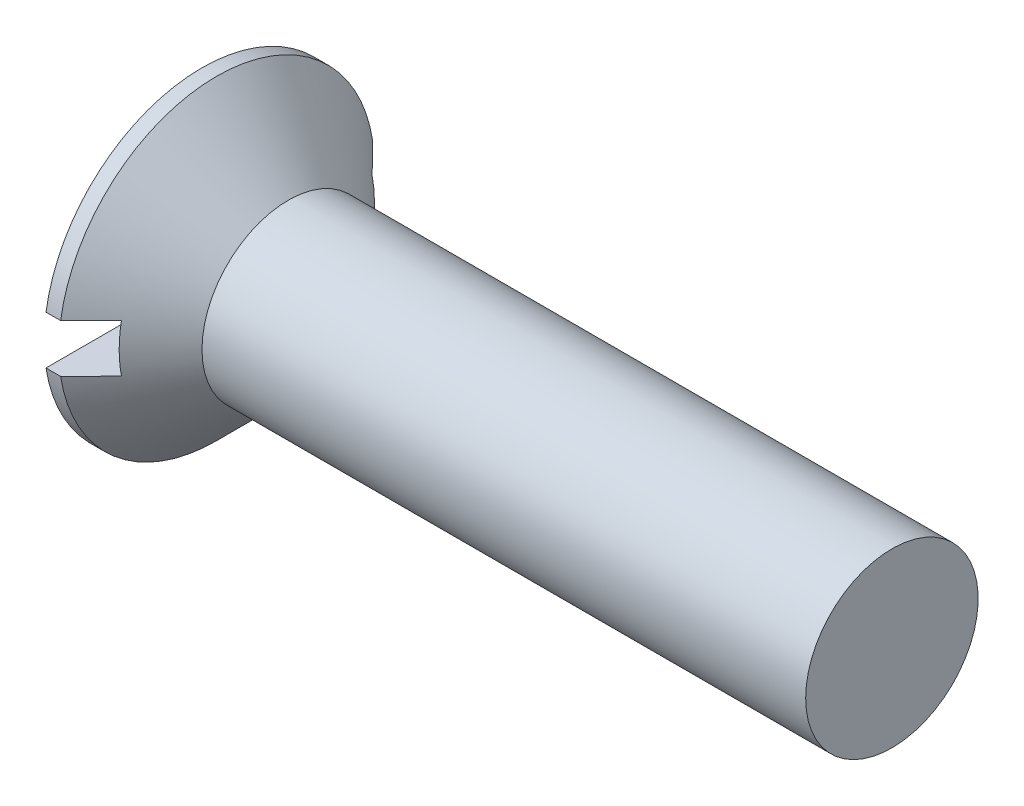
ISO-10303-21;
HEADER;
FILE_DESCRIPTION(('STEP AP214'),'2;1');
FILE_NAME('part.step','',(''),(''),'','','');
FILE_SCHEMA(('AUTOMOTIVE_DESIGN { 1 0 10303 214 1 1 1 1 }'));
ENDSEC;
DATA;
#1=APPLICATION_CONTEXT('core data for automotive mechanical design processes');
#2=APPLICATION_PROTOCOL_DEFINITION('international standard','automotive_design',2000,#1);
#3=PRODUCT_CONTEXT('',#1,'mechanical');
#4=PRODUCT('Part','Part','',(#3));
#5=PRODUCT_RELATED_PRODUCT_CATEGORY('part','',(#4));
#6=PRODUCT_DEFINITION_FORMATION('','',#4);
#7=PRODUCT_DEFINITION_CONTEXT('part definition',#1,'design');
#8=PRODUCT_DEFINITION('design','',#6,#7);
#9=PRODUCT_DEFINITION_SHAPE('','',#8);
#10=(LENGTH_UNIT() NAMED_UNIT(*) SI_UNIT(.MILLI.,.METRE.));
#11=(NAMED_UNIT(*) PLANE_ANGLE_UNIT() SI_UNIT($,.RADIAN.));
#12=(NAMED_UNIT(*) SI_UNIT($,.STERADIAN.) SOLID_ANGLE_UNIT());
#13=UNCERTAINTY_MEASURE_WITH_UNIT(LENGTH_MEASURE(1.E-05),#10,'distance_accuracy_value','');
#14=(GEOMETRIC_REPRESENTATION_CONTEXT(3) GLOBAL_UNCERTAINTY_ASSIGNED_CONTEXT((#13)) GLOBAL_UNIT_ASSIGNED_CONTEXT((#10,
#11,#12)) REPRESENTATION_CONTEXT('',''));
#15=CARTESIAN_POINT('',(0.,0.,0.));
#16=DIRECTION('',(0.,0.,1.));
#17=DIRECTION('',(1.,0.,0.));
#18=AXIS2_PLACEMENT_3D('',#15,#16,#17);
#19=CARTESIAN_POINT('',(2.6,-1.4,-9.15));
#20=DIRECTION('',(1.,0.,0.));
#21=DIRECTION('',(0.,0.,-1.));
#22=AXIS2_PLACEMENT_3D('',#19,#20,#21);
#23=PLANE('',#22);
#24=DIRECTION('',(0.,0.,1.));
#25=VECTOR('',#24,1.);
#26=CARTESIAN_POINT('',(2.6,-0.774782608695622,-9.15));
#27=LINE('',#26,#25);
#28=CARTESIAN_POINT('',(2.6,-0.774782608695655,0.774782608695653));
#29=VERTEX_POINT('',#28);
#30=CARTESIAN_POINT('',(2.6,-0.774782608695663,3.00739130434782));
#31=VERTEX_POINT('',#30);
#32=EDGE_CURVE('E165',#29,#31,#27,.T.);
#33=ORIENTED_EDGE('',*,*,#32,.F.);
#34=DIRECTION('',(0.,1.,0.));
#35=VECTOR('',#34,1.);
#36=CARTESIAN_POINT('',(2.6,-1.4,0.774782608695655));
#37=LINE('',#36,#35);
#38=CARTESIAN_POINT('',(2.6,-1.4,0.774782608695655));
#39=VERTEX_POINT('',#38);
#40=EDGE_CURVE('E11',#39,#29,#37,.T.);
#41=ORIENTED_EDGE('',*,*,#40,.F.);
#42=DIRECTION('',(0.,0.,1.));
#43=VECTOR('',#42,1.);
#44=CARTESIAN_POINT('',(2.6,-1.4,-9.15));
#45=LINE('',#44,#43);
#46=CARTESIAN_POINT('',(2.6,-1.4,7.26636084983399));
#47=VERTEX_POINT('',#46);
#48=EDGE_CURVE('E231',#39,#47,#45,.T.);
#49=ORIENTED_EDGE('',*,*,#48,.T.);
#50=CARTESIAN_POINT('',(2.6,0.,0.));
#51=DIRECTION('',(1.,0.,0.));
#52=DIRECTION('',(0.,0.,-1.));
#53=AXIS2_PLACEMENT_3D('',#50,#51,#52);
#54=CIRCLE('',#53,7.40000000000001);
#55=CARTESIAN_POINT('',(2.6,1.4,7.26636084983399));
#56=VERTEX_POINT('',#55);
#57=EDGE_CURVE('E267',#47,#56,#54,.F.);
#58=ORIENTED_EDGE('',*,*,#57,.T.);
#59=DIRECTION('',(0.,0.,-1.));
#60=VECTOR('',#59,1.);
#61=CARTESIAN_POINT('',(2.6,1.4,9.15));
#62=LINE('',#61,#60);
#63=CARTESIAN_POINT('',(2.6,1.4,0.774782608695654));
#64=VERTEX_POINT('',#63);
#65=EDGE_CURVE('E228',#56,#64,#62,.T.);
#66=ORIENTED_EDGE('',*,*,#65,.T.);
#67=CARTESIAN_POINT('',(2.6,0.774782608695649,0.774782608695653));
#68=VERTEX_POINT('',#67);
#69=EDGE_CURVE('E42',#68,#64,#37,.T.);
#70=ORIENTED_EDGE('',*,*,#69,.F.);
#71=DIRECTION('',(0.,0.,-1.));
#72=VECTOR('',#71,1.);
#73=CARTESIAN_POINT('',(2.6,0.774782608695683,-9.14999999999999));
#74=LINE('',#73,#72);
#75=CARTESIAN_POINT('',(2.6,0.774782608695642,3.00739130434783));
#76=VERTEX_POINT('',#75);
#77=EDGE_CURVE('E375',#76,#68,#74,.T.);
#78=ORIENTED_EDGE('',*,*,#77,.F.);
#79=DIRECTION('',(0.,1.,0.));
#80=VECTOR('',#79,1.);
#81=CARTESIAN_POINT('',(2.6,-1.40000000000004,3.00739130434782));
#82=LINE('',#81,#80);
#83=EDGE_CURVE('E319',#31,#76,#82,.T.);
#84=ORIENTED_EDGE('',*,*,#83,.F.);
#85=EDGE_LOOP('',(#33,#41,#49,#58,#66,#70,#78,#84));
#86=FACE_BOUND('',#85,.T.);
#87=ADVANCED_FACE('F34',(#86),#23,.F.);
#88=DIRECTION('',(0.,0.,1.));
#89=VECTOR('',#88,1.);
#90=CARTESIAN_POINT('',(2.6,-0.774782608695622,-9.15));
#91=LINE('',#90,#89);
#92=CARTESIAN_POINT('',(2.6,-0.774782608695642,-3.00739130434783));
#93=VERTEX_POINT('',#92);
#94=CARTESIAN_POINT('',(2.6,-0.77478260869565,-0.774782608695652));
#95=VERTEX_POINT('',#94);
#96=EDGE_CURVE('E190',#93,#95,#91,.T.);
#97=ORIENTED_EDGE('',*,*,#96,.F.);
#98=DIRECTION('',(0.,-1.,0.));
#99=VECTOR('',#98,1.);
#100=CARTESIAN_POINT('',(2.6,-1.40000000000002,-3.00739130434783));
#101=LINE('',#100,#99);
#102=CARTESIAN_POINT('',(2.6,0.774782608695662,-3.00739130434782));
#103=VERTEX_POINT('',#102);
#104=EDGE_CURVE('E369',#103,#93,#101,.T.);
#105=ORIENTED_EDGE('',*,*,#104,.F.);
#106=DIRECTION('',(0.,0.,-1.));
#107=VECTOR('',#106,1.);
#108=CARTESIAN_POINT('',(2.6,0.774782608695683,-9.14999999999999));
#109=LINE('',#108,#107);
#110=CARTESIAN_POINT('',(2.6,0.774782608695654,-0.774782608695652));
#111=VERTEX_POINT('',#110);
#112=EDGE_CURVE('E380',#111,#103,#109,.T.);
#113=ORIENTED_EDGE('',*,*,#112,.F.);
#114=DIRECTION('',(0.,-1.,0.));
#115=VECTOR('',#114,1.);
#116=CARTESIAN_POINT('',(2.6,-1.4,-0.774782608695653));
#117=LINE('',#116,#115);
#118=CARTESIAN_POINT('',(2.6,1.4,-0.774782608695653));
#119=VERTEX_POINT('',#118);
#120=EDGE_CURVE('E350',#119,#111,#117,.T.);
#121=ORIENTED_EDGE('',*,*,#120,.F.);
#122=CARTESIAN_POINT('',(2.6,1.4,-7.26636084983399));
#123=VERTEX_POINT('',#122);
#124=EDGE_CURVE('E56',#119,#123,#62,.T.);
#125=ORIENTED_EDGE('',*,*,#124,.T.);
#126=CARTESIAN_POINT('',(2.6,-1.4,-7.26636084983399));
#127=VERTEX_POINT('',#126);
#128=EDGE_CURVE('E264',#123,#127,#54,.F.);
#129=ORIENTED_EDGE('',*,*,#128,.T.);
#130=CARTESIAN_POINT('',(2.6,-1.4,-0.774782608695653));
#131=VERTEX_POINT('',#130);
#132=EDGE_CURVE('E232',#127,#131,#45,.T.);
#133=ORIENTED_EDGE('',*,*,#132,.T.);
#134=EDGE_CURVE('E349',#95,#131,#117,.T.);
#135=ORIENTED_EDGE('',*,*,#134,.F.);
#136=EDGE_LOOP('',(#97,#105,#113,#121,#125,#129,#133,#135));
#137=FACE_BOUND('',#136,.T.);
#138=ADVANCED_FACE('F312',(#137),#23,.F.);
#139=CARTESIAN_POINT('',(6.6459392575928,0.,0.439876265466817));
#140=DIRECTION('',(-0.0824937845566324,0.,-0.996591579088206));
#141=DIRECTION('',(-0.996591579088206,0.,0.0824937845566324));
#142=AXIS2_PLACEMENT_3D('',#139,#140,#141);
#143=PLANE('',#142);
#144=ORIENTED_EDGE('',*,*,#40,.T.);
#145=DIRECTION('',(0.993217774269884,0.0822145147597983,-0.0822145147597981));
#146=VECTOR('',#145,1.);
#147=CARTESIAN_POINT('',(6.68185819745171,-0.436903042184183,0.436903042184182));
#148=LINE('',#147,#146);
#149=CARTESIAN_POINT('',(5.98,-0.495000000000002,0.494999999999998));
#150=VERTEX_POINT('',#149);
#151=EDGE_CURVE('E163',#29,#150,#148,.T.);
#152=ORIENTED_EDGE('',*,*,#151,.T.);
#153=DIRECTION('',(0.800804244667336,0.595246633368948,-0.0662873078779819));
#154=VECTOR('',#153,1.);
#155=CARTESIAN_POINT('',(0.,-4.94,0.990000000000001));
#156=LINE('',#155,#154);
#157=CARTESIAN_POINT('',(0.,-4.94,0.990000000000001));
#158=VERTEX_POINT('',#157);
#159=EDGE_CURVE('E187',#158,#150,#156,.T.);
#160=ORIENTED_EDGE('',*,*,#159,.F.);
#161=DIRECTION('',(0.,-1.,0.));
#162=VECTOR('',#161,1.);
#163=CARTESIAN_POINT('',(0.,4.94,0.989999999999999));
#164=LINE('',#163,#162);
#165=CARTESIAN_POINT('',(0.,-1.4,0.99));
#166=VERTEX_POINT('',#165);
#167=EDGE_CURVE('E326',#166,#158,#164,.T.);
#168=ORIENTED_EDGE('',*,*,#167,.F.);
#169=DIRECTION('',(0.996591579088206,0.,-0.0824937845566324));
#170=VECTOR('',#169,1.);
#171=CARTESIAN_POINT('',(3.4159422920296,-1.4,0.707242235024309));
#172=LINE('',#171,#170);
#173=EDGE_CURVE('E223',#166,#39,#172,.T.);
#174=ORIENTED_EDGE('',*,*,#173,.T.);
#175=EDGE_LOOP('',(#144,#152,#160,#168,#174));
#176=FACE_BOUND('',#175,.T.);
#177=ADVANCED_FACE('F185',(#176),#143,.T.);
#178=DIRECTION('',(0.800804244667336,-0.595246633368948,-0.0662873078779817));
#179=VECTOR('',#178,1.);
#180=CARTESIAN_POINT('',(0.,4.94,0.989999999999999));
#181=LINE('',#180,#179);
#182=CARTESIAN_POINT('',(0.,4.94,0.989999999999999));
#183=VERTEX_POINT('',#182);
#184=CARTESIAN_POINT('',(5.98,0.495,0.495));
#185=VERTEX_POINT('',#184);
#186=EDGE_CURVE('E210',#183,#185,#181,.T.);
#187=ORIENTED_EDGE('',*,*,#186,.T.);
#188=DIRECTION('',(-0.993217774269884,0.0822145147597977,0.082214514759798));
#189=VECTOR('',#188,1.);
#190=CARTESIAN_POINT('',(6.68185819745171,0.43690304218418,0.436903042184181));
#191=LINE('',#190,#189);
#192=EDGE_CURVE('E377',#185,#68,#191,.T.);
#193=ORIENTED_EDGE('',*,*,#192,.T.);
#194=ORIENTED_EDGE('',*,*,#69,.T.);
#195=DIRECTION('',(-0.996591579088206,0.,0.0824937845566324));
#196=VECTOR('',#195,1.);
#197=CARTESIAN_POINT('',(1.91145151043211,1.4,0.831777843200017));
#198=LINE('',#197,#196);
#199=CARTESIAN_POINT('',(0.,1.4,0.99));
#200=VERTEX_POINT('',#199);
#201=EDGE_CURVE('E225',#64,#200,#198,.T.);
#202=ORIENTED_EDGE('',*,*,#201,.T.);
#203=EDGE_CURVE('E327',#183,#200,#164,.T.);
#204=ORIENTED_EDGE('',*,*,#203,.F.);
#205=EDGE_LOOP('',(#187,#193,#194,#202,#204));
#206=FACE_BOUND('',#205,.T.);
#207=ADVANCED_FACE('F413',(#206),#143,.T.);
#208=CARTESIAN_POINT('',(6.6459392575928,0.,-0.439876265466817));
#209=DIRECTION('',(-0.0824937845566324,0.,0.996591579088206));
#210=DIRECTION('',(0.996591579088206,0.,0.0824937845566324));
#211=AXIS2_PLACEMENT_3D('',#208,#209,#210);
#212=PLANE('',#211);
#213=DIRECTION('',(0.800804244667336,0.595246633368948,0.0662873078779818));
#214=VECTOR('',#213,1.);
#215=CARTESIAN_POINT('',(0.,-4.94,-0.99));
#216=LINE('',#215,#214);
#217=CARTESIAN_POINT('',(0.,-4.94,-0.99));
#218=VERTEX_POINT('',#217);
#219=CARTESIAN_POINT('',(5.98,-0.495,-0.495));
#220=VERTEX_POINT('',#219);
#221=EDGE_CURVE('E205',#218,#220,#216,.T.);
#222=ORIENTED_EDGE('',*,*,#221,.T.);
#223=DIRECTION('',(-0.993217774269884,-0.0822145147597978,-0.082214514759798));
#224=VECTOR('',#223,1.);
#225=CARTESIAN_POINT('',(6.68185819745171,-0.43690304218418,-0.436903042184181));
#226=LINE('',#225,#224);
#227=EDGE_CURVE('E366',#220,#95,#226,.T.);
#228=ORIENTED_EDGE('',*,*,#227,.T.);
#229=ORIENTED_EDGE('',*,*,#134,.T.);
#230=DIRECTION('',(-0.996591579088206,0.,-0.0824937845566324));
#231=VECTOR('',#230,1.);
#232=CARTESIAN_POINT('',(1.91145151043211,-1.4,-0.831777843200017));
#233=LINE('',#232,#231);
#234=CARTESIAN_POINT('',(0.,-1.4,-0.99));
#235=VERTEX_POINT('',#234);
#236=EDGE_CURVE('E220',#131,#235,#233,.T.);
#237=ORIENTED_EDGE('',*,*,#236,.T.);
#238=DIRECTION('',(0.,1.,0.));
#239=VECTOR('',#238,1.);
#240=CARTESIAN_POINT('',(0.,-4.94,-0.99));
#241=LINE('',#240,#239);
#242=EDGE_CURVE('E208',#218,#235,#241,.T.);
#243=ORIENTED_EDGE('',*,*,#242,.F.);
#244=EDGE_LOOP('',(#222,#228,#229,#237,#243));
#245=FACE_BOUND('',#244,.T.);
#246=ADVANCED_FACE('F363',(#245),#212,.T.);
#247=ORIENTED_EDGE('',*,*,#120,.T.);
#248=DIRECTION('',(0.993217774269884,-0.0822145147597983,0.082214514759798));
#249=VECTOR('',#248,1.);
#250=CARTESIAN_POINT('',(6.68185819745171,0.436903042184183,-0.436903042184181));
#251=LINE('',#250,#249);
#252=CARTESIAN_POINT('',(5.98,0.495000000000002,-0.494999999999998));
#253=VERTEX_POINT('',#252);
#254=EDGE_CURVE('E382',#111,#253,#251,.T.);
#255=ORIENTED_EDGE('',*,*,#254,.T.);
#256=DIRECTION('',(0.800804244667336,-0.595246633368948,0.0662873078779818));
#257=VECTOR('',#256,1.);
#258=CARTESIAN_POINT('',(0.,4.94,-0.99));
#259=LINE('',#258,#257);
#260=CARTESIAN_POINT('',(0.,4.94,-0.99));
#261=VERTEX_POINT('',#260);
#262=EDGE_CURVE('E199',#261,#253,#259,.T.);
#263=ORIENTED_EDGE('',*,*,#262,.F.);
#264=CARTESIAN_POINT('',(0.,1.4,-0.99));
#265=VERTEX_POINT('',#264);
#266=EDGE_CURVE('E204',#265,#261,#241,.T.);
#267=ORIENTED_EDGE('',*,*,#266,.F.);
#268=DIRECTION('',(0.996591579088206,0.,0.0824937845566324));
#269=VECTOR('',#268,1.);
#270=CARTESIAN_POINT('',(3.4159422920296,1.4,-0.707242235024309));
#271=LINE('',#270,#269);
#272=EDGE_CURVE('E49',#265,#119,#271,.T.);
#273=ORIENTED_EDGE('',*,*,#272,.T.);
#274=EDGE_LOOP('',(#247,#255,#263,#267,#273));
#275=FACE_BOUND('',#274,.T.);
#276=ADVANCED_FACE('F416',(#275),#212,.T.);
#277=CARTESIAN_POINT('',(0.,0.,0.));
#278=DIRECTION('',(-1.,0.,0.));
#279=DIRECTION('',(0.,0.,1.));
#280=AXIS2_PLACEMENT_3D('',#277,#278,#279);
#281=PLANE('',#280);
#282=DIRECTION('',(0.,0.,1.));
#283=VECTOR('',#282,1.);
#284=CARTESIAN_POINT('',(0.,4.94,-0.99));
#285=LINE('',#284,#283);
#286=EDGE_CURVE('E323',#261,#183,#285,.T.);
#287=ORIENTED_EDGE('',*,*,#286,.T.);
#288=ORIENTED_EDGE('',*,*,#203,.T.);
#289=DIRECTION('',(0.,0.,-1.));
#290=VECTOR('',#289,1.);
#291=CARTESIAN_POINT('',(0.,1.4,9.15));
#292=LINE('',#291,#290);
#293=CARTESIAN_POINT('',(0.,1.4,9.0422618851701));
#294=VERTEX_POINT('',#293);
#295=EDGE_CURVE('E236',#294,#200,#292,.T.);
#296=ORIENTED_EDGE('',*,*,#295,.F.);
#297=CARTESIAN_POINT('',(0.,0.,0.));
#298=DIRECTION('',(-1.,0.,0.));
#299=DIRECTION('',(0.,0.,1.));
#300=AXIS2_PLACEMENT_3D('',#297,#298,#299);
#301=CIRCLE('',#300,9.15);
#302=CARTESIAN_POINT('',(0.,1.4,-9.0422618851701));
#303=VERTEX_POINT('',#302);
#304=EDGE_CURVE('E263',#294,#303,#301,.T.);
#305=ORIENTED_EDGE('',*,*,#304,.T.);
#306=EDGE_CURVE('E227',#265,#303,#292,.T.);
#307=ORIENTED_EDGE('',*,*,#306,.F.);
#308=ORIENTED_EDGE('',*,*,#266,.T.);
#309=EDGE_LOOP('',(#287,#288,#296,#305,#307,#308));
#310=FACE_BOUND('',#309,.T.);
#311=ADVANCED_FACE('F36',(#310),#281,.T.);
#312=DIRECTION('',(0.,0.,1.));
#313=VECTOR('',#312,1.);
#314=CARTESIAN_POINT('',(0.,-1.4,-9.15));
#315=LINE('',#314,#313);
#316=CARTESIAN_POINT('',(0.,-1.4,9.0422618851701));
#317=VERTEX_POINT('',#316);
#318=EDGE_CURVE('E239',#166,#317,#315,.T.);
#319=ORIENTED_EDGE('',*,*,#318,.F.);
#320=ORIENTED_EDGE('',*,*,#167,.T.);
#321=DIRECTION('',(0.,0.,-1.));
#322=VECTOR('',#321,1.);
#323=CARTESIAN_POINT('',(0.,-4.94,0.990000000000001));
#324=LINE('',#323,#322);
#325=EDGE_CURVE('E203',#158,#218,#324,.T.);
#326=ORIENTED_EDGE('',*,*,#325,.T.);
#327=ORIENTED_EDGE('',*,*,#242,.T.);
#328=CARTESIAN_POINT('',(0.,-1.4,-9.0422618851701));
#329=VERTEX_POINT('',#328);
#330=EDGE_CURVE('E240',#329,#235,#315,.T.);
#331=ORIENTED_EDGE('',*,*,#330,.F.);
#332=EDGE_CURVE('E260',#329,#317,#301,.T.);
#333=ORIENTED_EDGE('',*,*,#332,.T.);
#334=EDGE_LOOP('',(#319,#320,#326,#327,#331,#333));
#335=FACE_BOUND('',#334,.T.);
#336=ADVANCED_FACE('F297',(#335),#281,.T.);
#337=CARTESIAN_POINT('',(2.6,1.4,9.15));
#338=DIRECTION('',(0.,1.,0.));
#339=DIRECTION('',(0.,0.,1.));
#340=AXIS2_PLACEMENT_3D('',#337,#338,#339);
#341=PLANE('',#340);
#342=ORIENTED_EDGE('',*,*,#201,.F.);
#343=ORIENTED_EDGE('',*,*,#65,.F.);
#344=CARTESIAN_POINT('',(-10.1802906614588,1.4,-20.1316698557512));
#345=CARTESIAN_POINT('',(-9.48488043298228,1.4,-19.4345666201556));
#346=CARTESIAN_POINT('',(-8.78954455363777,1.4,-18.7373891609851));
#347=CARTESIAN_POINT('',(-7.39910043445031,1.4,-17.3427719540358));
#348=CARTESIAN_POINT('',(-6.70399220084266,1.4,-16.6453322000407));
#349=CARTESIAN_POINT('',(-5.31371206148003,1.4,-15.2497048155075));
#350=CARTESIAN_POINT('',(-4.6185403553646,1.4,-14.5515169860536));
#351=CARTESIAN_POINT('',(-3.22873871546778,1.4,-13.1546366924144));
#352=CARTESIAN_POINT('',(-2.53410876869493,1.4,-12.4559442411553));
#353=CARTESIAN_POINT('',(-1.14548224055076,1.4,-11.0575206345502));
#354=CARTESIAN_POINT('',(-0.451485906136947,1.4,-10.3577892337916));
#355=CARTESIAN_POINT('',(0.588390603329139,1.4,-9.30703247995864));
#356=CARTESIAN_POINT('',(0.934843002413313,1.4,-8.95657352849666));
#357=CARTESIAN_POINT('',(1.62719938835855,1.4,-8.2551191709717));
#358=CARTESIAN_POINT('',(1.97310337925641,1.4,-7.90412376889521));
#359=CARTESIAN_POINT('',(2.66398514694666,1.4,-7.20147284141355));
#360=CARTESIAN_POINT('',(3.00896321428025,1.4,-6.84981760175461));
#361=CARTESIAN_POINT('',(3.69769802945329,1.4,-6.14529129721105));
#362=CARTESIAN_POINT('',(4.04145474223793,1.4,-5.79242019799284));
#363=CARTESIAN_POINT('',(4.55549337314532,1.4,-5.26161172777983));
#364=CARTESIAN_POINT('',(4.72656238682918,1.4,-5.08443689111279));
#365=CARTESIAN_POINT('',(5.06798185988705,1.4,-4.72939656642209));
#366=CARTESIAN_POINT('',(5.23833232155516,1.4,-4.55153108060692));
#367=CARTESIAN_POINT('',(5.57802572591668,1.4,-4.19485557401774));
#368=CARTESIAN_POINT('',(5.7473687145206,1.4,-4.01604559699614));
#369=CARTESIAN_POINT('',(6.08460595089404,1.4,-3.65706575802822));
#370=CARTESIAN_POINT('',(6.25250022470158,1.4,-3.47689592063249));
#371=CARTESIAN_POINT('',(6.46471077647202,1.4,-3.24632629007188));
#372=CARTESIAN_POINT('',(6.51006483972923,1.4,-3.19688150609182));
#373=CARTESIAN_POINT('',(6.60058022361491,1.4,-3.09781558301871));
#374=CARTESIAN_POINT('',(6.64574154363798,1.4,-3.04819444337264));
#375=CARTESIAN_POINT('',(6.78090070161663,1.4,-2.89903015221317));
#376=CARTESIAN_POINT('',(6.87057083906247,1.4,-2.79918927121578));
#377=CARTESIAN_POINT('',(7.04886062729584,1.4,-2.59833920956725));
#378=CARTESIAN_POINT('',(7.13747875576387,1.4,-2.49732867521849));
#379=CARTESIAN_POINT('',(7.31309984074697,1.4,-2.29392146631554));
#380=CARTESIAN_POINT('',(7.40010292731351,1.4,-2.19152490452969));
#381=CARTESIAN_POINT('',(7.55767384917085,1.4,-2.00181576169137));
#382=CARTESIAN_POINT('',(7.62859032868367,1.4,-1.91479370288945));
#383=CARTESIAN_POINT('',(7.76816100241459,1.4,-1.73895756265594));
#384=CARTESIAN_POINT('',(7.83681542973158,1.4,-1.65014366739901));
#385=CARTESIAN_POINT('',(7.97081438730525,1.4,-1.47010756313905));
#386=CARTESIAN_POINT('',(8.03616068050879,1.4,-1.37888667713564));
#387=CARTESIAN_POINT('',(8.16185481795934,1.4,-1.19309429595569));
#388=CARTESIAN_POINT('',(8.22220597308291,1.4,-1.0985250804488));
#389=CARTESIAN_POINT('',(8.33132072434372,1.4,-0.911003142488491));
#390=CARTESIAN_POINT('',(8.38058324145228,1.4,-0.818346947978579));
#391=CARTESIAN_POINT('',(8.4679772203323,1.4,-0.62787959546742));
#392=CARTESIAN_POINT('',(8.50612811789059,1.4,-0.530077796075779));
#393=CARTESIAN_POINT('',(8.55923073108678,1.4,-0.348849904330401));
#394=CARTESIAN_POINT('',(8.57726952854541,1.4,-0.266379839912257));
#395=CARTESIAN_POINT('',(8.59349195610696,1.4,-0.141377361201956));
#396=CARTESIAN_POINT('',(8.59709473917006,1.4,-0.0995235945665665));
#397=CARTESIAN_POINT('',(8.60053735444463,1.4,-0.0156540201724839));
#398=CARTESIAN_POINT('',(8.60037724406726,1.4,0.0263617851041769));
#399=CARTESIAN_POINT('',(8.59629462216206,1.4,0.110198182835154));
#400=CARTESIAN_POINT('',(8.59237279776442,1.4,0.152018809539687));
#401=CARTESIAN_POINT('',(8.5809825684757,1.4,0.235176084548624));
#402=CARTESIAN_POINT('',(8.57351339899295,1.4,0.276512626544739));
#403=CARTESIAN_POINT('',(8.55537007077989,1.4,0.358554412928613));
#404=CARTESIAN_POINT('',(8.54468949866927,1.4,0.399258221020585));
#405=CARTESIAN_POINT('',(8.5205557967028,1.4,0.479823786953263));
#406=CARTESIAN_POINT('',(8.50710265311226,1.4,0.519685540621547));
#407=CARTESIAN_POINT('',(8.45598857372599,1.4,0.657534606153095));
#408=CARTESIAN_POINT('',(8.41222351574168,1.4,0.753257424528381));
#409=CARTESIAN_POINT('',(8.31559263367326,1.4,0.940019642134538));
#410=CARTESIAN_POINT('',(8.26270605903273,1.4,1.03104773415757));
#411=CARTESIAN_POINT('',(8.15070766112158,1.4,1.21029142661936));
#412=CARTESIAN_POINT('',(8.09154412067923,1.4,1.2984743635146));
#413=CARTESIAN_POINT('',(7.99997236203098,1.4,1.42865262234275));
#414=CARTESIAN_POINT('',(7.96899427298008,1.4,1.47167410830265));
#415=CARTESIAN_POINT('',(7.90624286041765,1.4,1.55713237389056));
#416=CARTESIAN_POINT('',(7.87446956446809,1.4,1.59956917370505));
#417=CARTESIAN_POINT('',(7.77069466033925,1.4,1.73595964112493));
#418=CARTESIAN_POINT('',(7.69739242049313,1.4,1.82892258419788));
#419=CARTESIAN_POINT('',(7.54857227415178,1.4,2.01306279893539));
#420=CARTESIAN_POINT('',(7.47305407473414,1.4,2.10423983184423));
#421=CARTESIAN_POINT('',(7.32040938866978,1.4,2.28529575942909));
#422=CARTESIAN_POINT('',(7.24328228035727,1.4,2.37517412872904));
#423=CARTESIAN_POINT('',(7.0878605764758,1.4,2.55391719822478));
#424=CARTESIAN_POINT('',(7.00956594745415,1.4,2.64278186924606));
#425=CARTESIAN_POINT('',(6.7731341321893,1.4,2.90848075734406));
#426=CARTESIAN_POINT('',(6.61368386678828,1.4,3.08414520481737));
#427=CARTESIAN_POINT('',(6.2927022190868,1.4,3.43347386961335));
#428=CARTESIAN_POINT('',(6.13117133971699,1.4,3.60713855179007));
#429=CARTESIAN_POINT('',(5.80761409964983,1.4,3.95217228611247));
#430=CARTESIAN_POINT('',(5.64559564213671,1.4,4.12354875708039));
#431=CARTESIAN_POINT('',(5.32058360592324,1.4,4.46539281787538));
#432=CARTESIAN_POINT('',(5.1575899686771,1.4,4.63586035194776));
#433=CARTESIAN_POINT('',(4.83104912339113,1.4,4.97597335628547));
#434=CARTESIAN_POINT('',(4.66750253492793,1.4,5.14561942180073));
#435=CARTESIAN_POINT('',(4.33989126297806,1.4,5.48440367859122));
#436=CARTESIAN_POINT('',(4.17582658989263,1.4,5.65354187993118));
#437=CARTESIAN_POINT('',(3.71981430769449,1.4,6.12255600621086));
#438=CARTESIAN_POINT('',(3.4274406203696,1.4,6.42201756281031));
#439=CARTESIAN_POINT('',(2.84187679686423,1.4,7.02014164576414));
#440=CARTESIAN_POINT('',(2.5486866590775,1.4,7.31880417054427));
#441=CARTESIAN_POINT('',(1.66827583502464,1.4,8.21397933499673));
#442=CARTESIAN_POINT('',(1.0802219070279,1.4,8.80967222109664));
#443=CARTESIAN_POINT('',(-0.0972987867163045,1.4,10.0001447069985));
#444=CARTESIAN_POINT('',(-0.686766035285578,1.4,10.5949238285768));
#445=CARTESIAN_POINT('',(-1.86641300136396,1.4,11.7837688200009));
#446=CARTESIAN_POINT('',(-2.45659271507678,1.4,12.3778346936138));
#447=CARTESIAN_POINT('',(-3.64096240809459,1.4,13.5690800205838));
#448=CARTESIAN_POINT('',(-4.2351551612671,1.4,14.1662567151544));
#449=CARTESIAN_POINT('',(-5.42386028814457,1.4,15.3602940049768));
#450=CARTESIAN_POINT('',(-6.01837266241674,1.4,15.9571545996639));
#451=CARTESIAN_POINT('',(-7.20735875067841,1.4,17.1503857488358));
#452=CARTESIAN_POINT('',(-7.8018323644246,1.4,17.7467564032186));
#453=CARTESIAN_POINT('',(-8.99094844027763,1.4,18.9393270528177));
#454=CARTESIAN_POINT('',(-9.58559090205492,1.4,19.5355270483625));
#455=CARTESIAN_POINT('',(-10.1802906614588,1.4,20.1316698557512));
#456=B_SPLINE_CURVE_WITH_KNOTS('',3,(#344,#345,#346,#347,#348,#349,#350,#351,#352,#353,#354,
#355,#356,#357,#358,#359,#360,#361,#362,#363,#364,#365,#366,#367,#368,#369,#370,#371,#372,#373,
#374,#375,#376,#377,#378,#379,#380,#381,#382,#383,#384,#385,#386,#387,#388,#389,#390,#391,#392,
#393,#394,#395,#396,#397,#398,#399,#400,#401,#402,#403,#404,#405,#406,#407,#408,#409,#410,#411,
#412,#413,#414,#415,#416,#417,#418,#419,#420,#421,#422,#423,#424,#425,#426,#427,#428,#429,#430,
#431,#432,#433,#434,#435,#436,#437,#438,#439,#440,#441,#442,#443,#444,#445,#446,#447,#448,#449,
#450,#451,#452,#453,#454,#455),.UNSPECIFIED.,.F.,.F.,(4,2,2,2,2,2,2,2,2,2,2,2,2,2,2,2,2,2,2,2,2,
2,2,2,2,2,2,2,2,2,2,2,2,2,2,2,2,2,2,2,2,2,2,2,2,2,2,2,2,2,2,2,2,2,2,4),(0.,2.95396937304096,
5.90801382908348,8.86378247261382,11.8194779117793,14.7760443304786,16.2544406203997,
17.7328259769105,19.2106748877432,20.6885658779588,21.4274148433696,22.1662614480938,
22.905074121667,23.6438734886506,23.8451589043427,24.0464449517988,24.4490298720391,
24.8521397656342,25.2552170566942,25.5919673290452,25.9286827908871,26.2652168819381,
26.6015260947749,26.9159109045623,27.2297424623561,27.4818473788177,27.6077225152511,
27.7335957311856,27.8594459589776,27.9853233247371,28.1114537645865,28.2375848292719,
28.552426709072,28.8679945051514,29.1864008404014,29.3454380749671,29.5044698048941,
29.8595721598892,30.2147216683739,30.5700110424212,30.9253106161226,31.6369936262996,
32.348507720191,33.0560179588863,33.7635711085621,34.4704963890892,35.1774075662441,
36.43296697936,37.6885288643546,40.1996834223125,42.7118740678154,45.224051386001,
47.7513354207122,50.2786239554754,52.8047892968122,55.3309497410762),.UNSPECIFIED.);
#457=CARTESIAN_POINT('',(0.850000000000015,1.4,9.0422618851701));
#458=VERTEX_POINT('',#457);
#459=EDGE_CURVE('E343',#56,#458,#456,.T.);
#460=ORIENTED_EDGE('',*,*,#459,.T.);
#461=DIRECTION('',(-1.,0.,0.));
#462=VECTOR('',#461,1.);
#463=CARTESIAN_POINT('',(-6.34999999999999,1.4,9.0422618851701));
#464=LINE('',#463,#462);
#465=EDGE_CURVE('E246',#458,#294,#464,.T.);
#466=ORIENTED_EDGE('',*,*,#465,.T.);
#467=ORIENTED_EDGE('',*,*,#295,.T.);
#468=EDGE_LOOP('',(#342,#343,#460,#466,#467));
#469=FACE_BOUND('',#468,.T.);
#470=ADVANCED_FACE('F293',(#469),#341,.F.);
#471=ORIENTED_EDGE('',*,*,#272,.F.);
#472=ORIENTED_EDGE('',*,*,#306,.T.);
#473=DIRECTION('',(-1.,0.,0.));
#474=VECTOR('',#473,1.);
#475=CARTESIAN_POINT('',(-6.34999999999999,1.4,-9.0422618851701));
#476=LINE('',#475,#474);
#477=CARTESIAN_POINT('',(0.850000000000014,1.4,-9.0422618851701));
#478=VERTEX_POINT('',#477);
#479=EDGE_CURVE('E248',#303,#478,#476,.F.);
#480=ORIENTED_EDGE('',*,*,#479,.T.);
#481=EDGE_CURVE('E275',#478,#123,#456,.T.);
#482=ORIENTED_EDGE('',*,*,#481,.T.);
#483=ORIENTED_EDGE('',*,*,#124,.F.);
#484=EDGE_LOOP('',(#471,#472,#480,#482,#483));
#485=FACE_BOUND('',#484,.T.);
#486=ADVANCED_FACE('F290',(#485),#341,.F.);
#487=CARTESIAN_POINT('',(2.6,-1.4,-9.15));
#488=DIRECTION('',(0.,-1.,0.));
#489=DIRECTION('',(0.,0.,-1.));
#490=AXIS2_PLACEMENT_3D('',#487,#488,#489);
#491=PLANE('',#490);
#492=ORIENTED_EDGE('',*,*,#173,.F.);
#493=ORIENTED_EDGE('',*,*,#318,.T.);
#494=DIRECTION('',(-1.,0.,0.));
#495=VECTOR('',#494,1.);
#496=CARTESIAN_POINT('',(-6.34999999999999,-1.4,9.0422618851701));
#497=LINE('',#496,#495);
#498=CARTESIAN_POINT('',(0.850000000000014,-1.4,9.0422618851701));
#499=VERTEX_POINT('',#498);
#500=EDGE_CURVE('E244',#317,#499,#497,.F.);
#501=ORIENTED_EDGE('',*,*,#500,.T.);
#502=CARTESIAN_POINT('',(-10.1802906614588,-1.4,20.1316698557512));
#503=CARTESIAN_POINT('',(-9.48488043298228,-1.4,19.4345666201556));
#504=CARTESIAN_POINT('',(-8.78954455363777,-1.4,18.7373891609851));
#505=CARTESIAN_POINT('',(-7.39910043445032,-1.4,17.3427719540358));
#506=CARTESIAN_POINT('',(-6.70399220084267,-1.4,16.6453322000407));
#507=CARTESIAN_POINT('',(-5.31371206148004,-1.4,15.2497048155075));
#508=CARTESIAN_POINT('',(-4.61854035536461,-1.4,14.5515169860536));
#509=CARTESIAN_POINT('',(-3.2287387154678,-1.4,13.1546366924144));
#510=CARTESIAN_POINT('',(-2.53410876869495,-1.4,12.4559442411554));
#511=CARTESIAN_POINT('',(-1.14548224055077,-1.4,11.0575206345502));
#512=CARTESIAN_POINT('',(-0.451485906136962,-1.4,10.3577892337916));
#513=CARTESIAN_POINT('',(0.588390603329128,-1.4,9.30703247995865));
#514=CARTESIAN_POINT('',(0.934843002413304,-1.4,8.95657352849668));
#515=CARTESIAN_POINT('',(1.62719938835854,-1.4,8.25511917097171));
#516=CARTESIAN_POINT('',(1.9731033792564,-1.4,7.90412376889522));
#517=CARTESIAN_POINT('',(2.66398514694665,-1.4,7.20147284141356));
#518=CARTESIAN_POINT('',(3.00896321428024,-1.4,6.84981760175462));
#519=CARTESIAN_POINT('',(3.69769802945328,-1.4,6.14529129721106));
#520=CARTESIAN_POINT('',(4.04145474223792,-1.4,5.79242019799284));
#521=CARTESIAN_POINT('',(4.55549337314532,-1.4,5.26161172777983));
#522=CARTESIAN_POINT('',(4.72656238682918,-1.4,5.0844368911128));
#523=CARTESIAN_POINT('',(5.06798185988705,-1.4,4.72939656642209));
#524=CARTESIAN_POINT('',(5.23833232155516,-1.4,4.55153108060693));
#525=CARTESIAN_POINT('',(5.57802572591668,-1.4,4.19485557401774));
#526=CARTESIAN_POINT('',(5.7473687145206,-1.4,4.01604559699614));
#527=CARTESIAN_POINT('',(6.08460595089404,-1.4,3.65706575802822));
#528=CARTESIAN_POINT('',(6.25250022470158,-1.4,3.4768959206325));
#529=CARTESIAN_POINT('',(6.46471077647202,-1.4,3.24632629007188));
#530=CARTESIAN_POINT('',(6.51006483972923,-1.4,3.19688150609182));
#531=CARTESIAN_POINT('',(6.60058022361491,-1.4,3.09781558301871));
#532=CARTESIAN_POINT('',(6.64574154363798,-1.4,3.04819444337264));
#533=CARTESIAN_POINT('',(6.78090070161663,-1.4,2.89903015221317));
#534=CARTESIAN_POINT('',(6.87057083906247,-1.4,2.79918927121578));
#535=CARTESIAN_POINT('',(7.04886062729584,-1.4,2.59833920956725));
#536=CARTESIAN_POINT('',(7.13747875576387,-1.4,2.49732867521849));
#537=CARTESIAN_POINT('',(7.31309984074697,-1.4,2.29392146631554));
#538=CARTESIAN_POINT('',(7.40010292731351,-1.4,2.19152490452969));
#539=CARTESIAN_POINT('',(7.55767384917085,-1.4,2.00181576169137));
#540=CARTESIAN_POINT('',(7.62859032868367,-1.4,1.91479370288945));
#541=CARTESIAN_POINT('',(7.76816100241459,-1.4,1.73895756265595));
#542=CARTESIAN_POINT('',(7.83681542973158,-1.4,1.65014366739901));
#543=CARTESIAN_POINT('',(7.97081438730525,-1.4,1.47010756313905));
#544=CARTESIAN_POINT('',(8.03616068050879,-1.4,1.37888667713565));
#545=CARTESIAN_POINT('',(8.16185481795934,-1.4,1.19309429595569));
#546=CARTESIAN_POINT('',(8.22220597308291,-1.4,1.09852508044881));
#547=CARTESIAN_POINT('',(8.33132072434371,-1.4,0.911003142488495));
#548=CARTESIAN_POINT('',(8.38058324145228,-1.4,0.818346947978583));
#549=CARTESIAN_POINT('',(8.4679772203323,-1.4,0.627879595467423));
#550=CARTESIAN_POINT('',(8.50612811789059,-1.4,0.530077796075782));
#551=CARTESIAN_POINT('',(8.55923073108678,-1.4,0.348849904330404));
#552=CARTESIAN_POINT('',(8.57726952854541,-1.4,0.26637983991226));
#553=CARTESIAN_POINT('',(8.59349195610696,-1.4,0.141377361201958));
#554=CARTESIAN_POINT('',(8.59709473917006,-1.4,0.0995235945665672));
#555=CARTESIAN_POINT('',(8.60053735444462,-1.4,0.0156540201724844));
#556=CARTESIAN_POINT('',(8.60037724406725,-1.4,-0.0263617851041753));
#557=CARTESIAN_POINT('',(8.59629462216206,-1.4,-0.110198182835152));
#558=CARTESIAN_POINT('',(8.59237279776442,-1.4,-0.152018809539685));
#559=CARTESIAN_POINT('',(8.5809825684757,-1.4,-0.235176084548622));
#560=CARTESIAN_POINT('',(8.57351339899295,-1.4,-0.276512626544738));
#561=CARTESIAN_POINT('',(8.55537007077989,-1.4,-0.358554412928613));
#562=CARTESIAN_POINT('',(8.54468949866927,-1.4,-0.399258221020585));
#563=CARTESIAN_POINT('',(8.5205557967028,-1.4,-0.479823786953262));
#564=CARTESIAN_POINT('',(8.50710265311226,-1.4,-0.519685540621545));
#565=CARTESIAN_POINT('',(8.45598857372599,-1.4,-0.657534606153092));
#566=CARTESIAN_POINT('',(8.41222351574169,-1.4,-0.753257424528378));
#567=CARTESIAN_POINT('',(8.31559263367327,-1.4,-0.940019642134534));
#568=CARTESIAN_POINT('',(8.26270605903273,-1.4,-1.03104773415756));
#569=CARTESIAN_POINT('',(8.15070766112158,-1.4,-1.21029142661935));
#570=CARTESIAN_POINT('',(8.09154412067923,-1.4,-1.29847436351459));
#571=CARTESIAN_POINT('',(7.99997236203098,-1.4,-1.42865262234274));
#572=CARTESIAN_POINT('',(7.96899427298008,-1.4,-1.47167410830264));
#573=CARTESIAN_POINT('',(7.90624286041765,-1.4,-1.55713237389056));
#574=CARTESIAN_POINT('',(7.87446956446809,-1.4,-1.59956917370504));
#575=CARTESIAN_POINT('',(7.77069466033926,-1.4,-1.73595964112493));
#576=CARTESIAN_POINT('',(7.69739242049314,-1.4,-1.82892258419787));
#577=CARTESIAN_POINT('',(7.54857227415179,-1.4,-2.01306279893538));
#578=CARTESIAN_POINT('',(7.47305407473415,-1.4,-2.10423983184422));
#579=CARTESIAN_POINT('',(7.32040938866979,-1.4,-2.28529575942908));
#580=CARTESIAN_POINT('',(7.24328228035728,-1.4,-2.37517412872903));
#581=CARTESIAN_POINT('',(7.08786057647581,-1.4,-2.55391719822476));
#582=CARTESIAN_POINT('',(7.00956594745416,-1.4,-2.64278186924605));
#583=CARTESIAN_POINT('',(6.77313413218931,-1.4,-2.90848075734405));
#584=CARTESIAN_POINT('',(6.61368386678829,-1.4,-3.08414520481736));
#585=CARTESIAN_POINT('',(6.29270221908682,-1.4,-3.43347386961333));
#586=CARTESIAN_POINT('',(6.13117133971701,-1.4,-3.60713855179005));
#587=CARTESIAN_POINT('',(5.80761409964984,-1.4,-3.95217228611244));
#588=CARTESIAN_POINT('',(5.64559564213673,-1.4,-4.12354875708037));
#589=CARTESIAN_POINT('',(5.32058360592326,-1.4,-4.46539281787535));
#590=CARTESIAN_POINT('',(5.15758996867712,-1.4,-4.63586035194774));
#591=CARTESIAN_POINT('',(4.83104912339115,-1.4,-4.97597335628545));
#592=CARTESIAN_POINT('',(4.66750253492796,-1.4,-5.1456194218007));
#593=CARTESIAN_POINT('',(4.33989126297809,-1.4,-5.4844036785912));
#594=CARTESIAN_POINT('',(4.17582658989266,-1.4,-5.65354187993116));
#595=CARTESIAN_POINT('',(3.71981430769452,-1.4,-6.12255600621083));
#596=CARTESIAN_POINT('',(3.42744062036962,-1.4,-6.42201756281029));
#597=CARTESIAN_POINT('',(2.84187679686425,-1.4,-7.02014164576411));
#598=CARTESIAN_POINT('',(2.54868665907753,-1.4,-7.31880417054424));
#599=CARTESIAN_POINT('',(1.66827583502467,-1.4,-8.2139793349967));
#600=CARTESIAN_POINT('',(1.08022190702793,-1.4,-8.80967222109661));
#601=CARTESIAN_POINT('',(-0.0972987867162794,-1.4,-10.0001447069985));
#602=CARTESIAN_POINT('',(-0.686766035285555,-1.4,-10.5949238285768));
#603=CARTESIAN_POINT('',(-1.86641300136394,-1.4,-11.7837688200009));
#604=CARTESIAN_POINT('',(-2.45659271507676,-1.4,-12.3778346936138));
#605=CARTESIAN_POINT('',(-3.64096240809457,-1.4,-13.5690800205838));
#606=CARTESIAN_POINT('',(-4.23515516126709,-1.4,-14.1662567151544));
#607=CARTESIAN_POINT('',(-5.42386028814455,-1.4,-15.3602940049768));
#608=CARTESIAN_POINT('',(-6.01837266241673,-1.4,-15.9571545996639));
#609=CARTESIAN_POINT('',(-7.2073587506784,-1.4,-17.1503857488358));
#610=CARTESIAN_POINT('',(-7.80183236442459,-1.4,-17.7467564032186));
#611=CARTESIAN_POINT('',(-8.99094844027763,-1.4,-18.9393270528177));
#612=CARTESIAN_POINT('',(-9.58559090205492,-1.4,-19.5355270483625));
#613=CARTESIAN_POINT('',(-10.1802906614588,-1.4,-20.1316698557512));
#614=B_SPLINE_CURVE_WITH_KNOTS('',3,(#502,#503,#504,#505,#506,#507,#508,#509,#510,#511,#512,
#513,#514,#515,#516,#517,#518,#519,#520,#521,#522,#523,#524,#525,#526,#527,#528,#529,#530,#531,
#532,#533,#534,#535,#536,#537,#538,#539,#540,#541,#542,#543,#544,#545,#546,#547,#548,#549,#550,
#551,#552,#553,#554,#555,#556,#557,#558,#559,#560,#561,#562,#563,#564,#565,#566,#567,#568,#569,
#570,#571,#572,#573,#574,#575,#576,#577,#578,#579,#580,#581,#582,#583,#584,#585,#586,#587,#588,
#589,#590,#591,#592,#593,#594,#595,#596,#597,#598,#599,#600,#601,#602,#603,#604,#605,#606,#607,
#608,#609,#610,#611,#612,#613),.UNSPECIFIED.,.F.,.F.,(4,2,2,2,2,2,2,2,2,2,2,2,2,2,2,2,2,2,2,2,2,
2,2,2,2,2,2,2,2,2,2,2,2,2,2,2,2,2,2,2,2,2,2,2,2,2,2,2,2,2,2,2,2,2,2,4),(0.,2.95396937304095,
5.90801382908346,8.8637824726138,11.8194779117793,14.7760443304786,16.2544406203997,
17.7328259769105,19.2106748877432,20.6885658779588,21.4274148433696,22.1662614480938,
22.905074121667,23.6438734886506,23.8451589043427,24.0464449517988,24.4490298720391,
24.8521397656342,25.2552170566942,25.5919673290452,25.9286827908871,26.2652168819381,
26.6015260947749,26.9159109045623,27.2297424623561,27.4818473788177,27.6077225152511,
27.7335957311856,27.8594459589776,27.9853233247372,28.1114537645865,28.2375848292719,
28.552426709072,28.8679945051515,29.1864008404014,29.3454380749671,29.5044698048941,
29.8595721598892,30.2147216683739,30.5700110424212,30.9253106161226,31.6369936262996,
32.348507720191,33.0560179588863,33.7635711085621,34.4704963890891,35.1774075662441,
36.4329669793599,37.6885288643546,40.1996834223124,42.7118740678153,45.224051386001,
47.7513354207122,50.2786239554754,52.8047892968122,55.3309497410762),.UNSPECIFIED.);
#615=EDGE_CURVE('E276',#499,#47,#614,.T.);
#616=ORIENTED_EDGE('',*,*,#615,.T.);
#617=ORIENTED_EDGE('',*,*,#48,.F.);
#618=EDGE_LOOP('',(#492,#493,#501,#616,#617));
#619=FACE_BOUND('',#618,.T.);
#620=ADVANCED_FACE('F285',(#619),#491,.F.);
#621=ORIENTED_EDGE('',*,*,#236,.F.);
#622=ORIENTED_EDGE('',*,*,#132,.F.);
#623=CARTESIAN_POINT('',(0.850000000000015,-1.4,-9.0422618851701));
#624=VERTEX_POINT('',#623);
#625=EDGE_CURVE('E266',#127,#624,#614,.T.);
#626=ORIENTED_EDGE('',*,*,#625,.T.);
#627=DIRECTION('',(-1.,0.,0.));
#628=VECTOR('',#627,1.);
#629=CARTESIAN_POINT('',(-6.34999999999999,-1.4,-9.0422618851701));
#630=LINE('',#629,#628);
#631=EDGE_CURVE('E235',#624,#329,#630,.T.);
#632=ORIENTED_EDGE('',*,*,#631,.T.);
#633=ORIENTED_EDGE('',*,*,#330,.T.);
#634=EDGE_LOOP('',(#621,#622,#626,#632,#633));
#635=FACE_BOUND('',#634,.T.);
#636=ADVANCED_FACE('F289',(#635),#491,.F.);
#637=CARTESIAN_POINT('',(-6.34999999999999,0.,0.));
#638=DIRECTION('',(-1.,0.,0.));
#639=DIRECTION('',(0.,0.,1.));
#640=AXIS2_PLACEMENT_3D('',#637,#638,#639);
#641=CYLINDRICAL_SURFACE('',#640,9.15);
#642=ORIENTED_EDGE('',*,*,#479,.F.);
#643=ORIENTED_EDGE('',*,*,#304,.F.);
#644=ORIENTED_EDGE('',*,*,#465,.F.);
#645=CARTESIAN_POINT('',(0.850000000000014,0.,0.));
#646=DIRECTION('',(-1.,0.,0.));
#647=DIRECTION('',(0.,0.,1.));
#648=AXIS2_PLACEMENT_3D('',#645,#646,#647);
#649=CIRCLE('',#648,9.15);
#650=EDGE_CURVE('E259',#458,#478,#649,.T.);
#651=ORIENTED_EDGE('',*,*,#650,.T.);
#652=EDGE_LOOP('',(#642,#643,#644,#651));
#653=FACE_BOUND('',#652,.T.);
#654=ADVANCED_FACE('F476',(#653),#641,.T.);
#655=ORIENTED_EDGE('',*,*,#500,.F.);
#656=ORIENTED_EDGE('',*,*,#332,.F.);
#657=ORIENTED_EDGE('',*,*,#631,.F.);
#658=EDGE_CURVE('E256',#624,#499,#649,.T.);
#659=ORIENTED_EDGE('',*,*,#658,.T.);
#660=EDGE_LOOP('',(#655,#656,#657,#659));
#661=FACE_BOUND('',#660,.T.);
#662=ADVANCED_FACE('F308',(#661),#641,.T.);
#663=CARTESIAN_POINT('',(0.850000000000014,0.,0.));
#664=DIRECTION('',(-1.,0.,0.));
#665=DIRECTION('',(0.,0.,1.));
#666=AXIS2_PLACEMENT_3D('',#663,#664,#665);
#667=CONICAL_SURFACE('',#666,9.15,0.78539816339745);
#668=ORIENTED_EDGE('',*,*,#459,.F.);
#669=ORIENTED_EDGE('',*,*,#57,.F.);
#670=ORIENTED_EDGE('',*,*,#615,.F.);
#671=ORIENTED_EDGE('',*,*,#658,.F.);
#672=ORIENTED_EDGE('',*,*,#625,.F.);
#673=ORIENTED_EDGE('',*,*,#128,.F.);
#674=ORIENTED_EDGE('',*,*,#481,.F.);
#675=ORIENTED_EDGE('',*,*,#650,.F.);
#676=EDGE_LOOP('',(#668,#669,#670,#671,#672,#673,#674,#675));
#677=FACE_BOUND('',#676,.T.);
#678=CARTESIAN_POINT('',(5.,0.,0.));
#679=DIRECTION('',(-1.,0.,0.));
#680=DIRECTION('',(0.,0.,1.));
#681=AXIS2_PLACEMENT_3D('',#678,#679,#680);
#682=CIRCLE('',#681,5.);
#683=CARTESIAN_POINT('',(5.,0.,5.));
#684=VERTEX_POINT('',#683);
#685=EDGE_CURVE('E253',#684,#684,#682,.T.);
#686=ORIENTED_EDGE('',*,*,#685,.T.);
#687=EDGE_LOOP('',(#686));
#688=FACE_BOUND('',#687,.T.);
#689=ADVANCED_FACE('F282',(#677,#688),#667,.T.);
#690=CARTESIAN_POINT('',(-6.34999999999999,0.,0.));
#691=DIRECTION('',(-1.,0.,0.));
#692=DIRECTION('',(0.,0.,1.));
#693=AXIS2_PLACEMENT_3D('',#690,#691,#692);
#694=CYLINDRICAL_SURFACE('',#693,5.);
#695=CARTESIAN_POINT('',(40.,0.,0.));
#696=DIRECTION('',(-1.,0.,0.));
#697=DIRECTION('',(0.,0.,1.));
#698=AXIS2_PLACEMENT_3D('',#695,#696,#697);
#699=CIRCLE('',#698,5.);
#700=CARTESIAN_POINT('',(40.,0.,5.));
#701=VERTEX_POINT('',#700);
#702=EDGE_CURVE('E250',#701,#701,#699,.T.);
#703=ORIENTED_EDGE('',*,*,#702,.T.);
#704=EDGE_LOOP('',(#703));
#705=FACE_BOUND('',#704,.T.);
#706=ORIENTED_EDGE('',*,*,#685,.F.);
#707=EDGE_LOOP('',(#706));
#708=FACE_BOUND('',#707,.T.);
#709=ADVANCED_FACE('F301',(#705,#708),#694,.T.);
#710=CARTESIAN_POINT('',(40.,5.,0.));
#711=DIRECTION('',(1.,0.,0.));
#712=DIRECTION('',(0.,0.,-1.));
#713=AXIS2_PLACEMENT_3D('',#710,#711,#712);
#714=PLANE('',#713);
#715=ORIENTED_EDGE('',*,*,#702,.F.);
#716=EDGE_LOOP('',(#715));
#717=FACE_BOUND('',#716,.T.);
#718=ADVANCED_FACE('F299',(#717),#714,.T.);
#719=CARTESIAN_POINT('',(5.98,0.495,-0.495));
#720=DIRECTION('',(1.,0.,0.));
#721=DIRECTION('',(0.,0.,-1.));
#722=AXIS2_PLACEMENT_3D('',#719,#720,#721);
#723=PLANE('',#722);
#724=DIRECTION('',(0.,1.,0.));
#725=VECTOR('',#724,1.);
#726=CARTESIAN_POINT('',(5.98,-0.495,-0.495));
#727=LINE('',#726,#725);
#728=EDGE_CURVE('E196',#220,#253,#727,.T.);
#729=ORIENTED_EDGE('',*,*,#728,.F.);
#730=DIRECTION('',(0.,0.,-1.));
#731=VECTOR('',#730,1.);
#732=CARTESIAN_POINT('',(5.98,-0.495,0.495));
#733=LINE('',#732,#731);
#734=EDGE_CURVE('E180',#150,#220,#733,.T.);
#735=ORIENTED_EDGE('',*,*,#734,.F.);
#736=DIRECTION('',(0.,-1.,0.));
#737=VECTOR('',#736,1.);
#738=CARTESIAN_POINT('',(5.98,0.495,0.495));
#739=LINE('',#738,#737);
#740=EDGE_CURVE('E172',#185,#150,#739,.T.);
#741=ORIENTED_EDGE('',*,*,#740,.F.);
#742=DIRECTION('',(0.,0.,1.));
#743=VECTOR('',#742,1.);
#744=CARTESIAN_POINT('',(5.98,0.495,-0.495));
#745=LINE('',#744,#743);
#746=EDGE_CURVE('E181',#253,#185,#745,.T.);
#747=ORIENTED_EDGE('',*,*,#746,.F.);
#748=EDGE_LOOP('',(#729,#735,#741,#747));
#749=FACE_BOUND('',#748,.T.);
#750=ADVANCED_FACE('F194',(#749),#723,.F.);
#751=CARTESIAN_POINT('',(5.98,-0.495,-0.495));
#752=DIRECTION('',(-0.596558717929624,0.802569433795085,0.));
#753=DIRECTION('',(-0.802569433795085,-0.596558717929624,0.));
#754=AXIS2_PLACEMENT_3D('',#751,#752,#753);
#755=PLANE('',#754);
#756=ORIENTED_EDGE('',*,*,#221,.F.);
#757=ORIENTED_EDGE('',*,*,#325,.F.);
#758=ORIENTED_EDGE('',*,*,#159,.T.);
#759=ORIENTED_EDGE('',*,*,#734,.T.);
#760=EDGE_LOOP('',(#756,#757,#758,#759));
#761=FACE_BOUND('',#760,.T.);
#762=ADVANCED_FACE('F201',(#761),#755,.T.);
#763=CARTESIAN_POINT('',(5.98,0.495,0.495));
#764=DIRECTION('',(-0.596558717929624,-0.802569433795085,0.));
#765=DIRECTION('',(0.802569433795085,-0.596558717929624,0.));
#766=AXIS2_PLACEMENT_3D('',#763,#764,#765);
#767=PLANE('',#766);
#768=ORIENTED_EDGE('',*,*,#186,.F.);
#769=ORIENTED_EDGE('',*,*,#286,.F.);
#770=ORIENTED_EDGE('',*,*,#262,.T.);
#771=ORIENTED_EDGE('',*,*,#746,.T.);
#772=EDGE_LOOP('',(#768,#769,#770,#771));
#773=FACE_BOUND('',#772,.T.);
#774=ADVANCED_FACE('F408',(#773),#767,.T.);
#775=CARTESIAN_POINT('',(5.98,-0.495000000000002,0.494999999999998));
#776=DIRECTION('',(-0.596558717929624,0.,-0.802569433795085));
#777=DIRECTION('',(0.802569433795085,0.,-0.596558717929624));
#778=AXIS2_PLACEMENT_3D('',#775,#776,#777);
#779=PLANE('',#778);
#780=ORIENTED_EDGE('',*,*,#83,.T.);
#781=DIRECTION('',(0.800804244667336,-0.0662873078779797,-0.595246633368948));
#782=VECTOR('',#781,1.);
#783=CARTESIAN_POINT('',(0.,0.989999999999982,4.94));
#784=LINE('',#783,#782);
#785=EDGE_CURVE('E169',#76,#185,#784,.T.);
#786=ORIENTED_EDGE('',*,*,#785,.T.);
#787=ORIENTED_EDGE('',*,*,#740,.T.);
#788=DIRECTION('',(0.800804244667336,0.0662873078779838,-0.595246633368948));
#789=VECTOR('',#788,1.);
#790=CARTESIAN_POINT('',(0.,-0.990000000000017,4.94));
#791=LINE('',#790,#789);
#792=EDGE_CURVE('E159',#31,#150,#791,.T.);
#793=ORIENTED_EDGE('',*,*,#792,.F.);
#794=EDGE_LOOP('',(#780,#786,#787,#793));
#795=FACE_BOUND('',#794,.T.);
#796=ADVANCED_FACE('F173',(#795),#779,.T.);
#797=CARTESIAN_POINT('',(6.6459392575928,0.439876265466817,0.));
#798=DIRECTION('',(-0.0824937845566324,-0.996591579088206,0.));
#799=DIRECTION('',(0.996591579088206,-0.0824937845566324,0.));
#800=AXIS2_PLACEMENT_3D('',#797,#798,#799);
#801=PLANE('',#800);
#802=ORIENTED_EDGE('',*,*,#77,.T.);
#803=ORIENTED_EDGE('',*,*,#192,.F.);
#804=ORIENTED_EDGE('',*,*,#785,.F.);
#805=EDGE_LOOP('',(#802,#803,#804));
#806=FACE_BOUND('',#805,.T.);
#807=ADVANCED_FACE('F401',(#806),#801,.T.);
#808=CARTESIAN_POINT('',(6.6459392575928,-0.439876265466817,0.));
#809=DIRECTION('',(-0.0824937845566324,0.996591579088206,0.));
#810=DIRECTION('',(-0.996591579088206,-0.0824937845566324,0.));
#811=AXIS2_PLACEMENT_3D('',#808,#809,#810);
#812=PLANE('',#811);
#813=ORIENTED_EDGE('',*,*,#32,.T.);
#814=ORIENTED_EDGE('',*,*,#792,.T.);
#815=ORIENTED_EDGE('',*,*,#151,.F.);
#816=EDGE_LOOP('',(#813,#814,#815));
#817=FACE_BOUND('',#816,.T.);
#818=ADVANCED_FACE('F161',(#817),#812,.T.);
#819=ORIENTED_EDGE('',*,*,#96,.T.);
#820=ORIENTED_EDGE('',*,*,#227,.F.);
#821=DIRECTION('',(0.800804244667336,0.0662873078779798,0.595246633368948));
#822=VECTOR('',#821,1.);
#823=CARTESIAN_POINT('',(0.,-0.989999999999983,-4.94));
#824=LINE('',#823,#822);
#825=EDGE_CURVE('E386',#93,#220,#824,.T.);
#826=ORIENTED_EDGE('',*,*,#825,.F.);
#827=EDGE_LOOP('',(#819,#820,#826));
#828=FACE_BOUND('',#827,.T.);
#829=ADVANCED_FACE('F392',(#828),#812,.T.);
#830=CARTESIAN_POINT('',(5.98,0.495000000000002,-0.494999999999998));
#831=DIRECTION('',(-0.596558717929624,0.,0.802569433795085));
#832=DIRECTION('',(-0.802569433795085,0.,-0.596558717929624));
#833=AXIS2_PLACEMENT_3D('',#830,#831,#832);
#834=PLANE('',#833);
#835=ORIENTED_EDGE('',*,*,#104,.T.);
#836=ORIENTED_EDGE('',*,*,#825,.T.);
#837=ORIENTED_EDGE('',*,*,#728,.T.);
#838=DIRECTION('',(0.800804244667336,-0.0662873078779839,0.595246633368948));
#839=VECTOR('',#838,1.);
#840=CARTESIAN_POINT('',(0.,0.990000000000017,-4.94));
#841=LINE('',#840,#839);
#842=EDGE_CURVE('E168',#103,#253,#841,.T.);
#843=ORIENTED_EDGE('',*,*,#842,.F.);
#844=EDGE_LOOP('',(#835,#836,#837,#843));
#845=FACE_BOUND('',#844,.T.);
#846=ADVANCED_FACE('F390',(#845),#834,.T.);
#847=ORIENTED_EDGE('',*,*,#112,.T.);
#848=ORIENTED_EDGE('',*,*,#842,.T.);
#849=ORIENTED_EDGE('',*,*,#254,.F.);
#850=EDGE_LOOP('',(#847,#848,#849));
#851=FACE_BOUND('',#850,.T.);
#852=ADVANCED_FACE('F399',(#851),#801,.T.);
#853=CLOSED_SHELL('',(#87,#138,#177,#207,#246,#276,#311,#336,#470,#486,#620,#636,#654,#662,#689,
#709,#718,#750,#762,#774,#796,#807,#818,#829,#846,#852));
#854=MANIFOLD_SOLID_BREP('B2',#853);
#855=ADVANCED_BREP_SHAPE_REPRESENTATION('',(#18,#854),#14);
#856=SHAPE_DEFINITION_REPRESENTATION(#9,#855);
ENDSEC;
END-ISO-10303-21;
